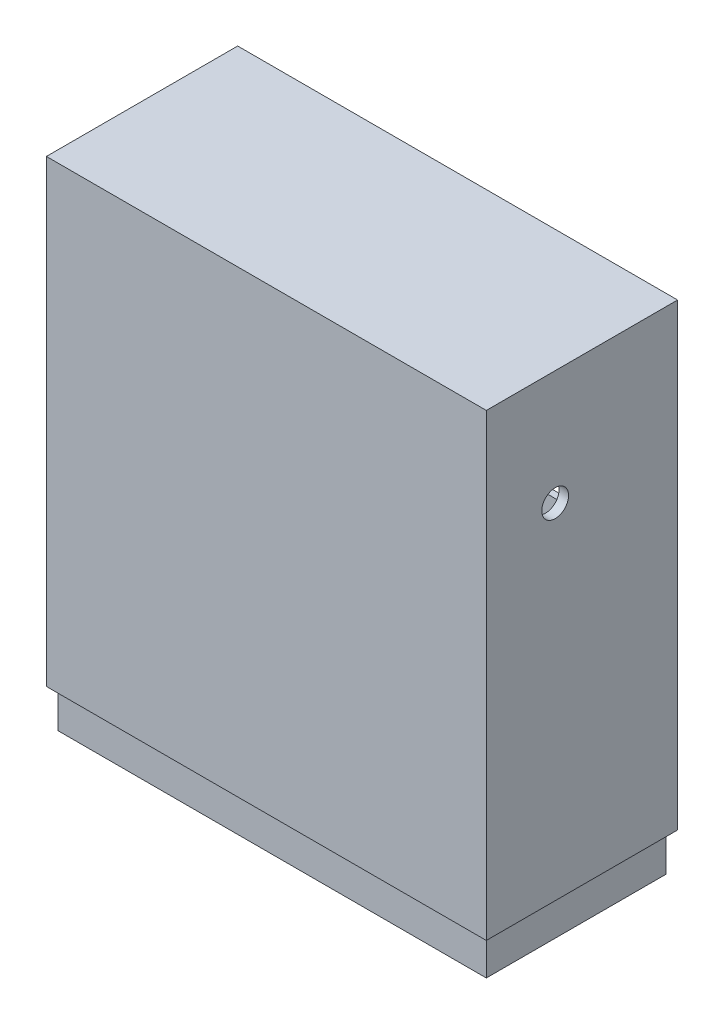
ISO-10303-21;
HEADER;
FILE_DESCRIPTION(('STEP AP214'),'2;1');
FILE_NAME('part.step','',(''),(''),'','','');
FILE_SCHEMA(('AUTOMOTIVE_DESIGN { 1 0 10303 214 1 1 1 1 }'));
ENDSEC;
DATA;
#1=APPLICATION_CONTEXT('core data for automotive mechanical design processes');
#2=APPLICATION_PROTOCOL_DEFINITION('international standard','automotive_design',2000,#1);
#3=PRODUCT_CONTEXT('',#1,'mechanical');
#4=PRODUCT('Part','Part','',(#3));
#5=PRODUCT_RELATED_PRODUCT_CATEGORY('part','',(#4));
#6=PRODUCT_DEFINITION_FORMATION('','',#4);
#7=PRODUCT_DEFINITION_CONTEXT('part definition',#1,'design');
#8=PRODUCT_DEFINITION('design','',#6,#7);
#9=PRODUCT_DEFINITION_SHAPE('','',#8);
#10=(LENGTH_UNIT() NAMED_UNIT(*) SI_UNIT(.MILLI.,.METRE.));
#11=(NAMED_UNIT(*) PLANE_ANGLE_UNIT() SI_UNIT($,.RADIAN.));
#12=(NAMED_UNIT(*) SI_UNIT($,.STERADIAN.) SOLID_ANGLE_UNIT());
#13=UNCERTAINTY_MEASURE_WITH_UNIT(LENGTH_MEASURE(1.E-05),#10,'distance_accuracy_value','');
#14=(GEOMETRIC_REPRESENTATION_CONTEXT(3) GLOBAL_UNCERTAINTY_ASSIGNED_CONTEXT((#13)) GLOBAL_UNIT_ASSIGNED_CONTEXT((#10,
#11,#12)) REPRESENTATION_CONTEXT('',''));
#15=CARTESIAN_POINT('',(0.,0.,0.));
#16=DIRECTION('',(0.,0.,1.));
#17=DIRECTION('',(1.,0.,0.));
#18=AXIS2_PLACEMENT_3D('',#15,#16,#17);
#19=CARTESIAN_POINT('',(0.,0.,0.));
#20=DIRECTION('',(0.,1.,0.));
#21=DIRECTION('',(0.,0.,1.));
#22=AXIS2_PLACEMENT_3D('',#19,#20,#21);
#23=PLANE('',#22);
#24=DIRECTION('',(0.,0.,1.));
#25=VECTOR('',#24,1.);
#26=CARTESIAN_POINT('',(-57.5,0.,-25.));
#27=LINE('',#26,#25);
#28=CARTESIAN_POINT('',(-57.5,0.,-25.));
#29=VERTEX_POINT('',#28);
#30=CARTESIAN_POINT('',(-57.5,0.,25.));
#31=VERTEX_POINT('',#30);
#32=EDGE_CURVE('E347',#29,#31,#27,.T.);
#33=ORIENTED_EDGE('',*,*,#32,.F.);
#34=DIRECTION('',(1.,0.,0.));
#35=VECTOR('',#34,1.);
#36=CARTESIAN_POINT('',(-57.5,0.,-25.));
#37=LINE('',#36,#35);
#38=CARTESIAN_POINT('',(57.5,0.,-25.));
#39=VERTEX_POINT('',#38);
#40=EDGE_CURVE('E361',#29,#39,#37,.T.);
#41=ORIENTED_EDGE('',*,*,#40,.T.);
#42=DIRECTION('',(0.,0.,1.));
#43=VECTOR('',#42,1.);
#44=CARTESIAN_POINT('',(57.5,0.,-25.));
#45=LINE('',#44,#43);
#46=CARTESIAN_POINT('',(57.5,0.,25.));
#47=VERTEX_POINT('',#46);
#48=EDGE_CURVE('E380',#39,#47,#45,.T.);
#49=ORIENTED_EDGE('',*,*,#48,.T.);
#50=DIRECTION('',(1.,0.,0.));
#51=VECTOR('',#50,1.);
#52=CARTESIAN_POINT('',(-57.5,0.,25.));
#53=LINE('',#52,#51);
#54=EDGE_CURVE('E376',#31,#47,#53,.T.);
#55=ORIENTED_EDGE('',*,*,#54,.F.);
#56=EDGE_LOOP('',(#33,#41,#49,#55));
#57=FACE_BOUND('',#56,.T.);
#58=DIRECTION('',(0.,0.,-1.));
#59=VECTOR('',#58,1.);
#60=CARTESIAN_POINT('',(-56.,0.,23.5));
#61=LINE('',#60,#59);
#62=CARTESIAN_POINT('',(-56.,0.,23.5));
#63=VERTEX_POINT('',#62);
#64=CARTESIAN_POINT('',(-56.,0.,-23.5));
#65=VERTEX_POINT('',#64);
#66=EDGE_CURVE('E242',#63,#65,#61,.T.);
#67=ORIENTED_EDGE('',*,*,#66,.F.);
#68=DIRECTION('',(-1.,0.,0.));
#69=VECTOR('',#68,1.);
#70=CARTESIAN_POINT('',(-56.,0.,23.5));
#71=LINE('',#70,#69);
#72=CARTESIAN_POINT('',(56.,0.,23.5));
#73=VERTEX_POINT('',#72);
#74=EDGE_CURVE('E248',#73,#63,#71,.T.);
#75=ORIENTED_EDGE('',*,*,#74,.F.);
#76=DIRECTION('',(0.,0.,1.));
#77=VECTOR('',#76,1.);
#78=CARTESIAN_POINT('',(56.,0.,23.5));
#79=LINE('',#78,#77);
#80=CARTESIAN_POINT('',(56.,0.,-23.5));
#81=VERTEX_POINT('',#80);
#82=EDGE_CURVE('E265',#81,#73,#79,.T.);
#83=ORIENTED_EDGE('',*,*,#82,.F.);
#84=DIRECTION('',(1.,0.,0.));
#85=VECTOR('',#84,1.);
#86=CARTESIAN_POINT('',(-56.,0.,-23.5));
#87=LINE('',#86,#85);
#88=EDGE_CURVE('E261',#65,#81,#87,.T.);
#89=ORIENTED_EDGE('',*,*,#88,.F.);
#90=EDGE_LOOP('',(#67,#75,#83,#89));
#91=FACE_BOUND('',#90,.T.);
#92=ADVANCED_FACE('F38',(#57,#91),#23,.F.);
#93=CARTESIAN_POINT('',(-57.5,120.,-25.));
#94=DIRECTION('',(1.,0.,0.));
#95=DIRECTION('',(0.,0.,-1.));
#96=AXIS2_PLACEMENT_3D('',#93,#94,#95);
#97=PLANE('',#96);
#98=ORIENTED_EDGE('',*,*,#32,.T.);
#99=DIRECTION('',(0.,-1.,0.));
#100=VECTOR('',#99,1.);
#101=CARTESIAN_POINT('',(-57.5,120.,25.));
#102=LINE('',#101,#100);
#103=CARTESIAN_POINT('',(-57.5,120.,25.));
#104=VERTEX_POINT('',#103);
#105=EDGE_CURVE('E48',#104,#31,#102,.T.);
#106=ORIENTED_EDGE('',*,*,#105,.F.);
#107=DIRECTION('',(0.,0.,1.));
#108=VECTOR('',#107,1.);
#109=CARTESIAN_POINT('',(-57.5,120.,-25.));
#110=LINE('',#109,#108);
#111=CARTESIAN_POINT('',(-57.5,120.,-25.));
#112=VERTEX_POINT('',#111);
#113=EDGE_CURVE('E356',#112,#104,#110,.T.);
#114=ORIENTED_EDGE('',*,*,#113,.F.);
#115=DIRECTION('',(0.,-1.,0.));
#116=VECTOR('',#115,1.);
#117=CARTESIAN_POINT('',(-57.5,120.,-25.));
#118=LINE('',#117,#116);
#119=EDGE_CURVE('E372',#112,#29,#118,.T.);
#120=ORIENTED_EDGE('',*,*,#119,.T.);
#121=EDGE_LOOP('',(#98,#106,#114,#120));
#122=FACE_BOUND('',#121,.T.);
#123=ADVANCED_FACE('F40',(#122),#97,.F.);
#124=CARTESIAN_POINT('',(-57.5,120.,25.));
#125=DIRECTION('',(0.,0.,-1.));
#126=DIRECTION('',(-1.,0.,0.));
#127=AXIS2_PLACEMENT_3D('',#124,#125,#126);
#128=PLANE('',#127);
#129=ORIENTED_EDGE('',*,*,#54,.T.);
#130=DIRECTION('',(0.,-1.,0.));
#131=VECTOR('',#130,1.);
#132=CARTESIAN_POINT('',(57.5,120.,25.));
#133=LINE('',#132,#131);
#134=CARTESIAN_POINT('',(57.5,120.,25.));
#135=VERTEX_POINT('',#134);
#136=EDGE_CURVE('E392',#135,#47,#133,.T.);
#137=ORIENTED_EDGE('',*,*,#136,.F.);
#138=DIRECTION('',(1.,0.,0.));
#139=VECTOR('',#138,1.);
#140=CARTESIAN_POINT('',(-57.5,120.,25.));
#141=LINE('',#140,#139);
#142=EDGE_CURVE('E360',#104,#135,#141,.T.);
#143=ORIENTED_EDGE('',*,*,#142,.F.);
#144=ORIENTED_EDGE('',*,*,#105,.T.);
#145=EDGE_LOOP('',(#129,#137,#143,#144));
#146=FACE_BOUND('',#145,.T.);
#147=ADVANCED_FACE('F399',(#146),#128,.F.);
#148=CARTESIAN_POINT('',(57.5,120.,-25.));
#149=DIRECTION('',(1.,0.,0.));
#150=DIRECTION('',(0.,0.,-1.));
#151=AXIS2_PLACEMENT_3D('',#148,#149,#150);
#152=PLANE('',#151);
#153=CARTESIAN_POINT('',(57.5,90.,7.00000000000001));
#154=DIRECTION('',(1.,0.,0.));
#155=DIRECTION('',(0.,0.,-1.));
#156=AXIS2_PLACEMENT_3D('',#153,#154,#155);
#157=CIRCLE('',#156,3.5);
#158=CARTESIAN_POINT('',(57.5,90.,3.50000000000001));
#159=VERTEX_POINT('',#158);
#160=EDGE_CURVE('E207',#159,#159,#157,.T.);
#161=ORIENTED_EDGE('',*,*,#160,.F.);
#162=EDGE_LOOP('',(#161));
#163=FACE_BOUND('',#162,.T.);
#164=ORIENTED_EDGE('',*,*,#48,.F.);
#165=DIRECTION('',(0.,-1.,0.));
#166=VECTOR('',#165,1.);
#167=CARTESIAN_POINT('',(57.5,120.,-25.));
#168=LINE('',#167,#166);
#169=CARTESIAN_POINT('',(57.5,120.,-25.));
#170=VERTEX_POINT('',#169);
#171=EDGE_CURVE('E389',#170,#39,#168,.T.);
#172=ORIENTED_EDGE('',*,*,#171,.F.);
#173=DIRECTION('',(0.,0.,1.));
#174=VECTOR('',#173,1.);
#175=CARTESIAN_POINT('',(57.5,120.,-25.));
#176=LINE('',#175,#174);
#177=EDGE_CURVE('E364',#170,#135,#176,.T.);
#178=ORIENTED_EDGE('',*,*,#177,.T.);
#179=ORIENTED_EDGE('',*,*,#136,.T.);
#180=EDGE_LOOP('',(#164,#172,#178,#179));
#181=FACE_BOUND('',#180,.T.);
#182=ADVANCED_FACE('F413',(#163,#181),#152,.T.);
#183=CARTESIAN_POINT('',(-57.5,120.,-25.));
#184=DIRECTION('',(0.,0.,-1.));
#185=DIRECTION('',(-1.,0.,0.));
#186=AXIS2_PLACEMENT_3D('',#183,#184,#185);
#187=PLANE('',#186);
#188=DIRECTION('',(0.,1.,0.));
#189=VECTOR('',#188,1.);
#190=CARTESIAN_POINT('',(-51.,115.056060941277,-25.));
#191=LINE('',#190,#189);
#192=CARTESIAN_POINT('',(-51.,54.0560609412771,-25.));
#193=VERTEX_POINT('',#192);
#194=CARTESIAN_POINT('',(-51.,115.056060941277,-25.));
#195=VERTEX_POINT('',#194);
#196=EDGE_CURVE('E287',#193,#195,#191,.T.);
#197=ORIENTED_EDGE('',*,*,#196,.F.);
#198=DIRECTION('',(-1.,0.,0.));
#199=VECTOR('',#198,1.);
#200=CARTESIAN_POINT('',(51.,54.0560609412771,-25.));
#201=LINE('',#200,#199);
#202=CARTESIAN_POINT('',(51.,54.0560609412771,-25.));
#203=VERTEX_POINT('',#202);
#204=EDGE_CURVE('E293',#203,#193,#201,.T.);
#205=ORIENTED_EDGE('',*,*,#204,.F.);
#206=DIRECTION('',(0.,-1.,0.));
#207=VECTOR('',#206,1.);
#208=CARTESIAN_POINT('',(51.,115.056060941277,-25.));
#209=LINE('',#208,#207);
#210=CARTESIAN_POINT('',(51.,115.056060941277,-25.));
#211=VERTEX_POINT('',#210);
#212=EDGE_CURVE('E312',#211,#203,#209,.T.);
#213=ORIENTED_EDGE('',*,*,#212,.F.);
#214=DIRECTION('',(1.,0.,0.));
#215=VECTOR('',#214,1.);
#216=CARTESIAN_POINT('',(51.,115.056060941277,-25.));
#217=LINE('',#216,#215);
#218=EDGE_CURVE('E308',#195,#211,#217,.T.);
#219=ORIENTED_EDGE('',*,*,#218,.F.);
#220=EDGE_LOOP('',(#197,#205,#213,#219));
#221=FACE_BOUND('',#220,.T.);
#222=ORIENTED_EDGE('',*,*,#40,.F.);
#223=ORIENTED_EDGE('',*,*,#119,.F.);
#224=DIRECTION('',(1.,0.,0.));
#225=VECTOR('',#224,1.);
#226=CARTESIAN_POINT('',(-57.5,120.,-25.));
#227=LINE('',#226,#225);
#228=EDGE_CURVE('E368',#112,#170,#227,.T.);
#229=ORIENTED_EDGE('',*,*,#228,.T.);
#230=ORIENTED_EDGE('',*,*,#171,.T.);
#231=EDGE_LOOP('',(#222,#223,#229,#230));
#232=FACE_BOUND('',#231,.T.);
#233=ADVANCED_FACE('F408',(#221,#232),#187,.T.);
#234=CARTESIAN_POINT('',(0.,120.,0.));
#235=DIRECTION('',(0.,1.,0.));
#236=DIRECTION('',(0.,0.,1.));
#237=AXIS2_PLACEMENT_3D('',#234,#235,#236);
#238=PLANE('',#237);
#239=ORIENTED_EDGE('',*,*,#113,.T.);
#240=ORIENTED_EDGE('',*,*,#142,.T.);
#241=ORIENTED_EDGE('',*,*,#177,.F.);
#242=ORIENTED_EDGE('',*,*,#228,.F.);
#243=EDGE_LOOP('',(#239,#240,#241,#242));
#244=FACE_BOUND('',#243,.T.);
#245=ADVANCED_FACE('F415',(#244),#238,.T.);
#246=CARTESIAN_POINT('',(0.,0.,-23.2));
#247=DIRECTION('',(0.,0.,-1.));
#248=DIRECTION('',(-1.,0.,0.));
#249=AXIS2_PLACEMENT_3D('',#246,#247,#248);
#250=PLANE('',#249);
#251=DIRECTION('',(0.,1.,0.));
#252=VECTOR('',#251,1.);
#253=CARTESIAN_POINT('',(-51.,115.056060941277,-23.2));
#254=LINE('',#253,#252);
#255=CARTESIAN_POINT('',(-51.,54.0560609412771,-23.2));
#256=VERTEX_POINT('',#255);
#257=CARTESIAN_POINT('',(-51.,115.056060941277,-23.2));
#258=VERTEX_POINT('',#257);
#259=EDGE_CURVE('E288',#256,#258,#254,.T.);
#260=ORIENTED_EDGE('',*,*,#259,.T.);
#261=DIRECTION('',(1.,0.,0.));
#262=VECTOR('',#261,1.);
#263=CARTESIAN_POINT('',(51.,115.056060941277,-23.2));
#264=LINE('',#263,#262);
#265=CARTESIAN_POINT('',(51.,115.056060941277,-23.2));
#266=VERTEX_POINT('',#265);
#267=EDGE_CURVE('E292',#258,#266,#264,.T.);
#268=ORIENTED_EDGE('',*,*,#267,.T.);
#269=DIRECTION('',(0.,-1.,0.));
#270=VECTOR('',#269,1.);
#271=CARTESIAN_POINT('',(51.,115.056060941277,-23.2));
#272=LINE('',#271,#270);
#273=CARTESIAN_POINT('',(51.,54.0560609412771,-23.2));
#274=VERTEX_POINT('',#273);
#275=EDGE_CURVE('E297',#266,#274,#272,.T.);
#276=ORIENTED_EDGE('',*,*,#275,.T.);
#277=DIRECTION('',(-1.,0.,0.));
#278=VECTOR('',#277,1.);
#279=CARTESIAN_POINT('',(51.,54.0560609412771,-23.2));
#280=LINE('',#279,#278);
#281=EDGE_CURVE('E301',#274,#256,#280,.T.);
#282=ORIENTED_EDGE('',*,*,#281,.T.);
#283=EDGE_LOOP('',(#260,#268,#276,#282));
#284=FACE_BOUND('',#283,.T.);
#285=DIRECTION('',(0.,-1.,0.));
#286=VECTOR('',#285,1.);
#287=CARTESIAN_POINT('',(-43.,106.556060941277,-23.2));
#288=LINE('',#287,#286);
#289=CARTESIAN_POINT('',(-43.,106.556060941277,-23.2));
#290=VERTEX_POINT('',#289);
#291=CARTESIAN_POINT('',(-43.,62.5560609412771,-23.2));
#292=VERTEX_POINT('',#291);
#293=EDGE_CURVE('E339',#290,#292,#288,.T.);
#294=ORIENTED_EDGE('',*,*,#293,.T.);
#295=DIRECTION('',(1.,0.,0.));
#296=VECTOR('',#295,1.);
#297=CARTESIAN_POINT('',(43.,62.5560609412771,-23.2));
#298=LINE('',#297,#296);
#299=CARTESIAN_POINT('',(43.,62.5560609412771,-23.2));
#300=VERTEX_POINT('',#299);
#301=EDGE_CURVE('E335',#292,#300,#298,.T.);
#302=ORIENTED_EDGE('',*,*,#301,.T.);
#303=DIRECTION('',(0.,1.,0.));
#304=VECTOR('',#303,1.);
#305=CARTESIAN_POINT('',(43.,106.556060941277,-23.2));
#306=LINE('',#305,#304);
#307=CARTESIAN_POINT('',(43.,106.556060941277,-23.2));
#308=VERTEX_POINT('',#307);
#309=EDGE_CURVE('E322',#300,#308,#306,.T.);
#310=ORIENTED_EDGE('',*,*,#309,.T.);
#311=DIRECTION('',(-1.,0.,0.));
#312=VECTOR('',#311,1.);
#313=CARTESIAN_POINT('',(43.,106.556060941277,-23.2));
#314=LINE('',#313,#312);
#315=EDGE_CURVE('E11',#308,#290,#314,.T.);
#316=ORIENTED_EDGE('',*,*,#315,.T.);
#317=EDGE_LOOP('',(#294,#302,#310,#316));
#318=FACE_BOUND('',#317,.T.);
#319=ADVANCED_FACE('F417',(#284,#318),#250,.T.);
#320=CARTESIAN_POINT('',(-51.,115.056060941277,-23.2));
#321=DIRECTION('',(-1.,0.,0.));
#322=DIRECTION('',(0.,0.,1.));
#323=AXIS2_PLACEMENT_3D('',#320,#321,#322);
#324=PLANE('',#323);
#325=ORIENTED_EDGE('',*,*,#196,.T.);
#326=DIRECTION('',(0.,0.,-1.));
#327=VECTOR('',#326,1.);
#328=CARTESIAN_POINT('',(-51.,115.056060941277,-23.2));
#329=LINE('',#328,#327);
#330=EDGE_CURVE('E305',#258,#195,#329,.T.);
#331=ORIENTED_EDGE('',*,*,#330,.F.);
#332=ORIENTED_EDGE('',*,*,#259,.F.);
#333=DIRECTION('',(0.,0.,-1.));
#334=VECTOR('',#333,1.);
#335=CARTESIAN_POINT('',(-51.,54.0560609412771,-23.2));
#336=LINE('',#335,#334);
#337=EDGE_CURVE('E319',#256,#193,#336,.T.);
#338=ORIENTED_EDGE('',*,*,#337,.T.);
#339=EDGE_LOOP('',(#325,#331,#332,#338));
#340=FACE_BOUND('',#339,.T.);
#341=ADVANCED_FACE('F423',(#340),#324,.F.);
#342=CARTESIAN_POINT('',(51.,54.0560609412771,-23.2));
#343=DIRECTION('',(0.,-1.,0.));
#344=DIRECTION('',(0.,0.,-1.));
#345=AXIS2_PLACEMENT_3D('',#342,#343,#344);
#346=PLANE('',#345);
#347=ORIENTED_EDGE('',*,*,#204,.T.);
#348=ORIENTED_EDGE('',*,*,#337,.F.);
#349=ORIENTED_EDGE('',*,*,#281,.F.);
#350=DIRECTION('',(0.,0.,-1.));
#351=VECTOR('',#350,1.);
#352=CARTESIAN_POINT('',(51.,54.0560609412771,-23.2));
#353=LINE('',#352,#351);
#354=EDGE_CURVE('E323',#274,#203,#353,.T.);
#355=ORIENTED_EDGE('',*,*,#354,.T.);
#356=EDGE_LOOP('',(#347,#348,#349,#355));
#357=FACE_BOUND('',#356,.T.);
#358=ADVANCED_FACE('F472',(#357),#346,.F.);
#359=CARTESIAN_POINT('',(51.,115.056060941277,-23.2));
#360=DIRECTION('',(1.,0.,0.));
#361=DIRECTION('',(0.,0.,-1.));
#362=AXIS2_PLACEMENT_3D('',#359,#360,#361);
#363=PLANE('',#362);
#364=ORIENTED_EDGE('',*,*,#212,.T.);
#365=ORIENTED_EDGE('',*,*,#354,.F.);
#366=ORIENTED_EDGE('',*,*,#275,.F.);
#367=DIRECTION('',(0.,0.,-1.));
#368=VECTOR('',#367,1.);
#369=CARTESIAN_POINT('',(51.,115.056060941277,-23.2));
#370=LINE('',#369,#368);
#371=EDGE_CURVE('E326',#266,#211,#370,.T.);
#372=ORIENTED_EDGE('',*,*,#371,.T.);
#373=EDGE_LOOP('',(#364,#365,#366,#372));
#374=FACE_BOUND('',#373,.T.);
#375=ADVANCED_FACE('F482',(#374),#363,.F.);
#376=CARTESIAN_POINT('',(51.,115.056060941277,-23.2));
#377=DIRECTION('',(0.,1.,0.));
#378=DIRECTION('',(0.,0.,1.));
#379=AXIS2_PLACEMENT_3D('',#376,#377,#378);
#380=PLANE('',#379);
#381=ORIENTED_EDGE('',*,*,#218,.T.);
#382=ORIENTED_EDGE('',*,*,#371,.F.);
#383=ORIENTED_EDGE('',*,*,#267,.F.);
#384=ORIENTED_EDGE('',*,*,#330,.T.);
#385=EDGE_LOOP('',(#381,#382,#383,#384));
#386=FACE_BOUND('',#385,.T.);
#387=ADVANCED_FACE('F492',(#386),#380,.F.);
#388=CARTESIAN_POINT('',(43.,106.556060941277,2.99999999999993));
#389=DIRECTION('',(0.,1.,0.));
#390=DIRECTION('',(0.,0.,1.));
#391=AXIS2_PLACEMENT_3D('',#388,#389,#390);
#392=PLANE('',#391);
#393=DIRECTION('',(0.,0.,-1.));
#394=VECTOR('',#393,1.);
#395=CARTESIAN_POINT('',(43.,106.556060941277,2.99999999999993));
#396=LINE('',#395,#394);
#397=CARTESIAN_POINT('',(43.,106.556060941277,-21.5));
#398=VERTEX_POINT('',#397);
#399=EDGE_CURVE('E351',#398,#308,#396,.T.);
#400=ORIENTED_EDGE('',*,*,#399,.F.);
#401=DIRECTION('',(-1.,0.,0.));
#402=VECTOR('',#401,1.);
#403=CARTESIAN_POINT('',(43.,106.556060941277,-21.5));
#404=LINE('',#403,#402);
#405=CARTESIAN_POINT('',(-43.,106.556060941277,-21.5));
#406=VERTEX_POINT('',#405);
#407=EDGE_CURVE('E238',#398,#406,#404,.T.);
#408=ORIENTED_EDGE('',*,*,#407,.T.);
#409=DIRECTION('',(0.,0.,-1.));
#410=VECTOR('',#409,1.);
#411=CARTESIAN_POINT('',(-43.,106.556060941277,2.99999999999993));
#412=LINE('',#411,#410);
#413=EDGE_CURVE('E343',#406,#290,#412,.T.);
#414=ORIENTED_EDGE('',*,*,#413,.T.);
#415=ORIENTED_EDGE('',*,*,#315,.F.);
#416=EDGE_LOOP('',(#400,#408,#414,#415));
#417=FACE_BOUND('',#416,.T.);
#418=ADVANCED_FACE('F501',(#417),#392,.F.);
#419=CARTESIAN_POINT('',(43.,106.556060941277,2.99999999999993));
#420=DIRECTION('',(1.,0.,0.));
#421=DIRECTION('',(0.,1.,0.));
#422=AXIS2_PLACEMENT_3D('',#419,#420,#421);
#423=PLANE('',#422);
#424=DIRECTION('',(0.,0.,-1.));
#425=VECTOR('',#424,1.);
#426=CARTESIAN_POINT('',(43.,62.5560609412771,2.99999999999993));
#427=LINE('',#426,#425);
#428=CARTESIAN_POINT('',(43.,62.5560609412771,-21.5));
#429=VERTEX_POINT('',#428);
#430=EDGE_CURVE('E348',#429,#300,#427,.T.);
#431=ORIENTED_EDGE('',*,*,#430,.F.);
#432=DIRECTION('',(0.,1.,0.));
#433=VECTOR('',#432,1.);
#434=CARTESIAN_POINT('',(43.,106.556060941277,-21.5));
#435=LINE('',#434,#433);
#436=EDGE_CURVE('E234',#429,#398,#435,.T.);
#437=ORIENTED_EDGE('',*,*,#436,.T.);
#438=ORIENTED_EDGE('',*,*,#399,.T.);
#439=ORIENTED_EDGE('',*,*,#309,.F.);
#440=EDGE_LOOP('',(#431,#437,#438,#439));
#441=FACE_BOUND('',#440,.T.);
#442=ADVANCED_FACE('F561',(#441),#423,.F.);
#443=CARTESIAN_POINT('',(43.,62.5560609412771,2.99999999999993));
#444=DIRECTION('',(0.,-1.,0.));
#445=DIRECTION('',(0.,0.,-1.));
#446=AXIS2_PLACEMENT_3D('',#443,#444,#445);
#447=PLANE('',#446);
#448=DIRECTION('',(0.,0.,-1.));
#449=VECTOR('',#448,1.);
#450=CARTESIAN_POINT('',(-43.,62.5560609412771,2.99999999999993));
#451=LINE('',#450,#449);
#452=CARTESIAN_POINT('',(-43.,62.5560609412771,-21.5));
#453=VERTEX_POINT('',#452);
#454=EDGE_CURVE('E344',#453,#292,#451,.T.);
#455=ORIENTED_EDGE('',*,*,#454,.F.);
#456=DIRECTION('',(1.,0.,0.));
#457=VECTOR('',#456,1.);
#458=CARTESIAN_POINT('',(43.,62.5560609412771,-21.5));
#459=LINE('',#458,#457);
#460=EDGE_CURVE('E55',#453,#429,#459,.T.);
#461=ORIENTED_EDGE('',*,*,#460,.T.);
#462=ORIENTED_EDGE('',*,*,#430,.T.);
#463=ORIENTED_EDGE('',*,*,#301,.F.);
#464=EDGE_LOOP('',(#455,#461,#462,#463));
#465=FACE_BOUND('',#464,.T.);
#466=ADVANCED_FACE('F571',(#465),#447,.F.);
#467=CARTESIAN_POINT('',(-43.,106.556060941277,2.99999999999993));
#468=DIRECTION('',(-1.,0.,0.));
#469=DIRECTION('',(0.,0.,1.));
#470=AXIS2_PLACEMENT_3D('',#467,#468,#469);
#471=PLANE('',#470);
#472=ORIENTED_EDGE('',*,*,#413,.F.);
#473=DIRECTION('',(0.,-1.,0.));
#474=VECTOR('',#473,1.);
#475=CARTESIAN_POINT('',(-43.,106.556060941277,-21.5));
#476=LINE('',#475,#474);
#477=EDGE_CURVE('E224',#406,#453,#476,.T.);
#478=ORIENTED_EDGE('',*,*,#477,.T.);
#479=ORIENTED_EDGE('',*,*,#454,.T.);
#480=ORIENTED_EDGE('',*,*,#293,.F.);
#481=EDGE_LOOP('',(#472,#478,#479,#480));
#482=FACE_BOUND('',#481,.T.);
#483=ADVANCED_FACE('F519',(#482),#471,.F.);
#484=CARTESIAN_POINT('',(-56.,-10.,23.5));
#485=DIRECTION('',(1.,0.,0.));
#486=DIRECTION('',(0.,0.,-1.));
#487=AXIS2_PLACEMENT_3D('',#484,#485,#486);
#488=PLANE('',#487);
#489=ORIENTED_EDGE('',*,*,#66,.T.);
#490=DIRECTION('',(0.,1.,0.));
#491=VECTOR('',#490,1.);
#492=CARTESIAN_POINT('',(-56.,-10.,-23.5));
#493=LINE('',#492,#491);
#494=CARTESIAN_POINT('',(-56.,-10.,-23.5));
#495=VERTEX_POINT('',#494);
#496=EDGE_CURVE('E283',#495,#65,#493,.T.);
#497=ORIENTED_EDGE('',*,*,#496,.F.);
#498=DIRECTION('',(0.,0.,-1.));
#499=VECTOR('',#498,1.);
#500=CARTESIAN_POINT('',(-56.,-10.,23.5));
#501=LINE('',#500,#499);
#502=CARTESIAN_POINT('',(-56.,-10.,23.5));
#503=VERTEX_POINT('',#502);
#504=EDGE_CURVE('E243',#503,#495,#501,.T.);
#505=ORIENTED_EDGE('',*,*,#504,.F.);
#506=DIRECTION('',(0.,1.,0.));
#507=VECTOR('',#506,1.);
#508=CARTESIAN_POINT('',(-56.,-10.,23.5));
#509=LINE('',#508,#507);
#510=EDGE_CURVE('E257',#503,#63,#509,.T.);
#511=ORIENTED_EDGE('',*,*,#510,.T.);
#512=EDGE_LOOP('',(#489,#497,#505,#511));
#513=FACE_BOUND('',#512,.T.);
#514=ADVANCED_FACE('F514',(#513),#488,.F.);
#515=CARTESIAN_POINT('',(-56.,-10.,-23.5));
#516=DIRECTION('',(0.,0.,1.));
#517=DIRECTION('',(1.,0.,0.));
#518=AXIS2_PLACEMENT_3D('',#515,#516,#517);
#519=PLANE('',#518);
#520=ORIENTED_EDGE('',*,*,#88,.T.);
#521=DIRECTION('',(0.,1.,0.));
#522=VECTOR('',#521,1.);
#523=CARTESIAN_POINT('',(56.,-10.,-23.5));
#524=LINE('',#523,#522);
#525=CARTESIAN_POINT('',(56.,-10.,-23.5));
#526=VERTEX_POINT('',#525);
#527=EDGE_CURVE('E279',#526,#81,#524,.T.);
#528=ORIENTED_EDGE('',*,*,#527,.F.);
#529=DIRECTION('',(1.,0.,0.));
#530=VECTOR('',#529,1.);
#531=CARTESIAN_POINT('',(-56.,-10.,-23.5));
#532=LINE('',#531,#530);
#533=EDGE_CURVE('E247',#495,#526,#532,.T.);
#534=ORIENTED_EDGE('',*,*,#533,.F.);
#535=ORIENTED_EDGE('',*,*,#496,.T.);
#536=EDGE_LOOP('',(#520,#528,#534,#535));
#537=FACE_BOUND('',#536,.T.);
#538=ADVANCED_FACE('F518',(#537),#519,.F.);
#539=CARTESIAN_POINT('',(56.,-10.,23.5));
#540=DIRECTION('',(-1.,0.,0.));
#541=DIRECTION('',(0.,0.,1.));
#542=AXIS2_PLACEMENT_3D('',#539,#540,#541);
#543=PLANE('',#542);
#544=ORIENTED_EDGE('',*,*,#82,.T.);
#545=DIRECTION('',(0.,1.,0.));
#546=VECTOR('',#545,1.);
#547=CARTESIAN_POINT('',(56.,-10.,23.5));
#548=LINE('',#547,#546);
#549=CARTESIAN_POINT('',(56.,-10.,23.5));
#550=VERTEX_POINT('',#549);
#551=EDGE_CURVE('E275',#550,#73,#548,.T.);
#552=ORIENTED_EDGE('',*,*,#551,.F.);
#553=DIRECTION('',(0.,0.,1.));
#554=VECTOR('',#553,1.);
#555=CARTESIAN_POINT('',(56.,-10.,23.5));
#556=LINE('',#555,#554);
#557=EDGE_CURVE('E251',#526,#550,#556,.T.);
#558=ORIENTED_EDGE('',*,*,#557,.F.);
#559=ORIENTED_EDGE('',*,*,#527,.T.);
#560=EDGE_LOOP('',(#544,#552,#558,#559));
#561=FACE_BOUND('',#560,.T.);
#562=ADVANCED_FACE('F530',(#561),#543,.F.);
#563=CARTESIAN_POINT('',(-56.,-10.,23.5));
#564=DIRECTION('',(0.,0.,-1.));
#565=DIRECTION('',(-1.,0.,0.));
#566=AXIS2_PLACEMENT_3D('',#563,#564,#565);
#567=PLANE('',#566);
#568=ORIENTED_EDGE('',*,*,#74,.T.);
#569=ORIENTED_EDGE('',*,*,#510,.F.);
#570=DIRECTION('',(-1.,0.,0.));
#571=VECTOR('',#570,1.);
#572=CARTESIAN_POINT('',(-56.,-10.,23.5));
#573=LINE('',#572,#571);
#574=EDGE_CURVE('E254',#550,#503,#573,.T.);
#575=ORIENTED_EDGE('',*,*,#574,.F.);
#576=ORIENTED_EDGE('',*,*,#551,.T.);
#577=EDGE_LOOP('',(#568,#569,#575,#576));
#578=FACE_BOUND('',#577,.T.);
#579=ADVANCED_FACE('F540',(#578),#567,.F.);
#580=CARTESIAN_POINT('',(0.,-10.,0.));
#581=DIRECTION('',(0.,-1.,0.));
#582=DIRECTION('',(0.,0.,-1.));
#583=AXIS2_PLACEMENT_3D('',#580,#581,#582);
#584=PLANE('',#583);
#585=DIRECTION('',(0.,0.,-1.));
#586=VECTOR('',#585,1.);
#587=CARTESIAN_POINT('',(-55.,-10.,22.5));
#588=LINE('',#587,#586);
#589=CARTESIAN_POINT('',(-55.,-10.,22.5));
#590=VERTEX_POINT('',#589);
#591=CARTESIAN_POINT('',(-55.,-10.,-21.5));
#592=VERTEX_POINT('',#591);
#593=EDGE_CURVE('E63',#590,#592,#588,.T.);
#594=ORIENTED_EDGE('',*,*,#593,.F.);
#595=DIRECTION('',(-1.,0.,0.));
#596=VECTOR('',#595,1.);
#597=CARTESIAN_POINT('',(-55.,-10.,22.5));
#598=LINE('',#597,#596);
#599=CARTESIAN_POINT('',(55.,-10.,22.5));
#600=VERTEX_POINT('',#599);
#601=EDGE_CURVE('E200',#600,#590,#598,.T.);
#602=ORIENTED_EDGE('',*,*,#601,.F.);
#603=DIRECTION('',(0.,0.,1.));
#604=VECTOR('',#603,1.);
#605=CARTESIAN_POINT('',(55.,-10.,22.5));
#606=LINE('',#605,#604);
#607=CARTESIAN_POINT('',(55.,-10.,-21.5));
#608=VERTEX_POINT('',#607);
#609=EDGE_CURVE('E204',#608,#600,#606,.T.);
#610=ORIENTED_EDGE('',*,*,#609,.F.);
#611=DIRECTION('',(1.,0.,0.));
#612=VECTOR('',#611,1.);
#613=CARTESIAN_POINT('',(-55.,-10.,-21.5));
#614=LINE('',#613,#612);
#615=EDGE_CURVE('E215',#592,#608,#614,.T.);
#616=ORIENTED_EDGE('',*,*,#615,.F.);
#617=EDGE_LOOP('',(#594,#602,#610,#616));
#618=FACE_BOUND('',#617,.T.);
#619=ORIENTED_EDGE('',*,*,#504,.T.);
#620=ORIENTED_EDGE('',*,*,#533,.T.);
#621=ORIENTED_EDGE('',*,*,#557,.T.);
#622=ORIENTED_EDGE('',*,*,#574,.T.);
#623=EDGE_LOOP('',(#619,#620,#621,#622));
#624=FACE_BOUND('',#623,.T.);
#625=ADVANCED_FACE('F550',(#618,#624),#584,.T.);
#626=CARTESIAN_POINT('',(-55.,117.,-21.5));
#627=DIRECTION('',(0.,0.,-1.));
#628=DIRECTION('',(-1.,0.,0.));
#629=AXIS2_PLACEMENT_3D('',#626,#627,#628);
#630=PLANE('',#629);
#631=ORIENTED_EDGE('',*,*,#615,.T.);
#632=DIRECTION('',(0.,-1.,0.));
#633=VECTOR('',#632,1.);
#634=CARTESIAN_POINT('',(55.,117.,-21.5));
#635=LINE('',#634,#633);
#636=CARTESIAN_POINT('',(55.,117.,-21.5));
#637=VERTEX_POINT('',#636);
#638=EDGE_CURVE('E185',#637,#608,#635,.T.);
#639=ORIENTED_EDGE('',*,*,#638,.F.);
#640=DIRECTION('',(1.,0.,0.));
#641=VECTOR('',#640,1.);
#642=CARTESIAN_POINT('',(-55.,117.,-21.5));
#643=LINE('',#642,#641);
#644=CARTESIAN_POINT('',(-55.,117.,-21.5));
#645=VERTEX_POINT('',#644);
#646=EDGE_CURVE('E189',#645,#637,#643,.T.);
#647=ORIENTED_EDGE('',*,*,#646,.F.);
#648=DIRECTION('',(0.,-1.,0.));
#649=VECTOR('',#648,1.);
#650=CARTESIAN_POINT('',(-55.,117.,-21.5));
#651=LINE('',#650,#649);
#652=EDGE_CURVE('E175',#645,#592,#651,.T.);
#653=ORIENTED_EDGE('',*,*,#652,.T.);
#654=EDGE_LOOP('',(#631,#639,#647,#653));
#655=FACE_BOUND('',#654,.T.);
#656=ORIENTED_EDGE('',*,*,#436,.F.);
#657=ORIENTED_EDGE('',*,*,#460,.F.);
#658=ORIENTED_EDGE('',*,*,#477,.F.);
#659=ORIENTED_EDGE('',*,*,#407,.F.);
#660=EDGE_LOOP('',(#656,#657,#658,#659));
#661=FACE_BOUND('',#660,.T.);
#662=ADVANCED_FACE('F190',(#655,#661),#630,.F.);
#663=CARTESIAN_POINT('',(-55.,117.,22.5));
#664=DIRECTION('',(-1.,0.,0.));
#665=DIRECTION('',(0.,0.,1.));
#666=AXIS2_PLACEMENT_3D('',#663,#664,#665);
#667=PLANE('',#666);
#668=ORIENTED_EDGE('',*,*,#593,.T.);
#669=ORIENTED_EDGE('',*,*,#652,.F.);
#670=DIRECTION('',(0.,0.,-1.));
#671=VECTOR('',#670,1.);
#672=CARTESIAN_POINT('',(-55.,117.,22.5));
#673=LINE('',#672,#671);
#674=CARTESIAN_POINT('',(-55.,117.,22.5));
#675=VERTEX_POINT('',#674);
#676=EDGE_CURVE('E179',#675,#645,#673,.T.);
#677=ORIENTED_EDGE('',*,*,#676,.F.);
#678=DIRECTION('',(0.,-1.,0.));
#679=VECTOR('',#678,1.);
#680=CARTESIAN_POINT('',(-55.,117.,22.5));
#681=LINE('',#680,#679);
#682=EDGE_CURVE('E221',#675,#590,#681,.T.);
#683=ORIENTED_EDGE('',*,*,#682,.T.);
#684=EDGE_LOOP('',(#668,#669,#677,#683));
#685=FACE_BOUND('',#684,.T.);
#686=ADVANCED_FACE('F177',(#685),#667,.F.);
#687=CARTESIAN_POINT('',(-55.,117.,22.5));
#688=DIRECTION('',(0.,0.,1.));
#689=DIRECTION('',(1.,0.,0.));
#690=AXIS2_PLACEMENT_3D('',#687,#688,#689);
#691=PLANE('',#690);
#692=ORIENTED_EDGE('',*,*,#601,.T.);
#693=ORIENTED_EDGE('',*,*,#682,.F.);
#694=DIRECTION('',(-1.,0.,0.));
#695=VECTOR('',#694,1.);
#696=CARTESIAN_POINT('',(-55.,117.,22.5));
#697=LINE('',#696,#695);
#698=CARTESIAN_POINT('',(55.,117.,22.5));
#699=VERTEX_POINT('',#698);
#700=EDGE_CURVE('E186',#699,#675,#697,.T.);
#701=ORIENTED_EDGE('',*,*,#700,.F.);
#702=DIRECTION('',(0.,-1.,0.));
#703=VECTOR('',#702,1.);
#704=CARTESIAN_POINT('',(55.,117.,22.5));
#705=LINE('',#704,#703);
#706=EDGE_CURVE('E225',#699,#600,#705,.T.);
#707=ORIENTED_EDGE('',*,*,#706,.T.);
#708=EDGE_LOOP('',(#692,#693,#701,#707));
#709=FACE_BOUND('',#708,.T.);
#710=ADVANCED_FACE('F611',(#709),#691,.F.);
#711=CARTESIAN_POINT('',(55.,117.,22.5));
#712=DIRECTION('',(1.,0.,0.));
#713=DIRECTION('',(0.,0.,-1.));
#714=AXIS2_PLACEMENT_3D('',#711,#712,#713);
#715=PLANE('',#714);
#716=CARTESIAN_POINT('',(55.,90.,7.00000000000001));
#717=DIRECTION('',(1.,0.,0.));
#718=DIRECTION('',(0.,0.,-1.));
#719=AXIS2_PLACEMENT_3D('',#716,#717,#718);
#720=CIRCLE('',#719,3.5);
#721=CARTESIAN_POINT('',(55.,90.,3.50000000000001));
#722=VERTEX_POINT('',#721);
#723=EDGE_CURVE('E42',#722,#722,#720,.T.);
#724=ORIENTED_EDGE('',*,*,#723,.T.);
#725=EDGE_LOOP('',(#724));
#726=FACE_BOUND('',#725,.T.);
#727=ORIENTED_EDGE('',*,*,#609,.T.);
#728=ORIENTED_EDGE('',*,*,#706,.F.);
#729=DIRECTION('',(0.,0.,1.));
#730=VECTOR('',#729,1.);
#731=CARTESIAN_POINT('',(55.,117.,22.5));
#732=LINE('',#731,#730);
#733=EDGE_CURVE('E195',#637,#699,#732,.T.);
#734=ORIENTED_EDGE('',*,*,#733,.F.);
#735=ORIENTED_EDGE('',*,*,#638,.T.);
#736=EDGE_LOOP('',(#727,#728,#734,#735));
#737=FACE_BOUND('',#736,.T.);
#738=ADVANCED_FACE('F619',(#726,#737),#715,.F.);
#739=CARTESIAN_POINT('',(0.,117.,0.));
#740=DIRECTION('',(0.,-1.,0.));
#741=DIRECTION('',(0.,0.,-1.));
#742=AXIS2_PLACEMENT_3D('',#739,#740,#741);
#743=PLANE('',#742);
#744=ORIENTED_EDGE('',*,*,#676,.T.);
#745=ORIENTED_EDGE('',*,*,#646,.T.);
#746=ORIENTED_EDGE('',*,*,#733,.T.);
#747=ORIENTED_EDGE('',*,*,#700,.T.);
#748=EDGE_LOOP('',(#744,#745,#746,#747));
#749=FACE_BOUND('',#748,.T.);
#750=ADVANCED_FACE('F197',(#749),#743,.T.);
#751=CARTESIAN_POINT('',(47.5,90.,7.00000000000001));
#752=DIRECTION('',(1.,0.,0.));
#753=DIRECTION('',(0.,0.,-1.));
#754=AXIS2_PLACEMENT_3D('',#751,#752,#753);
#755=CYLINDRICAL_SURFACE('',#754,3.5);
#756=ORIENTED_EDGE('',*,*,#160,.T.);
#757=EDGE_LOOP('',(#756));
#758=FACE_BOUND('',#757,.T.);
#759=ORIENTED_EDGE('',*,*,#723,.F.);
#760=EDGE_LOOP('',(#759));
#761=FACE_BOUND('',#760,.T.);
#762=ADVANCED_FACE('F630',(#758,#761),#755,.F.);
#763=CLOSED_SHELL('',(#92,#123,#147,#182,#233,#245,#319,#341,#358,#375,#387,#418,#442,#466,#483,
#514,#538,#562,#579,#625,#662,#686,#710,#738,#750,#762));
#764=MANIFOLD_SOLID_BREP('B2',#763);
#765=ADVANCED_BREP_SHAPE_REPRESENTATION('',(#18,#764),#14);
#766=SHAPE_DEFINITION_REPRESENTATION(#9,#765);
ENDSEC;
END-ISO-10303-21;
